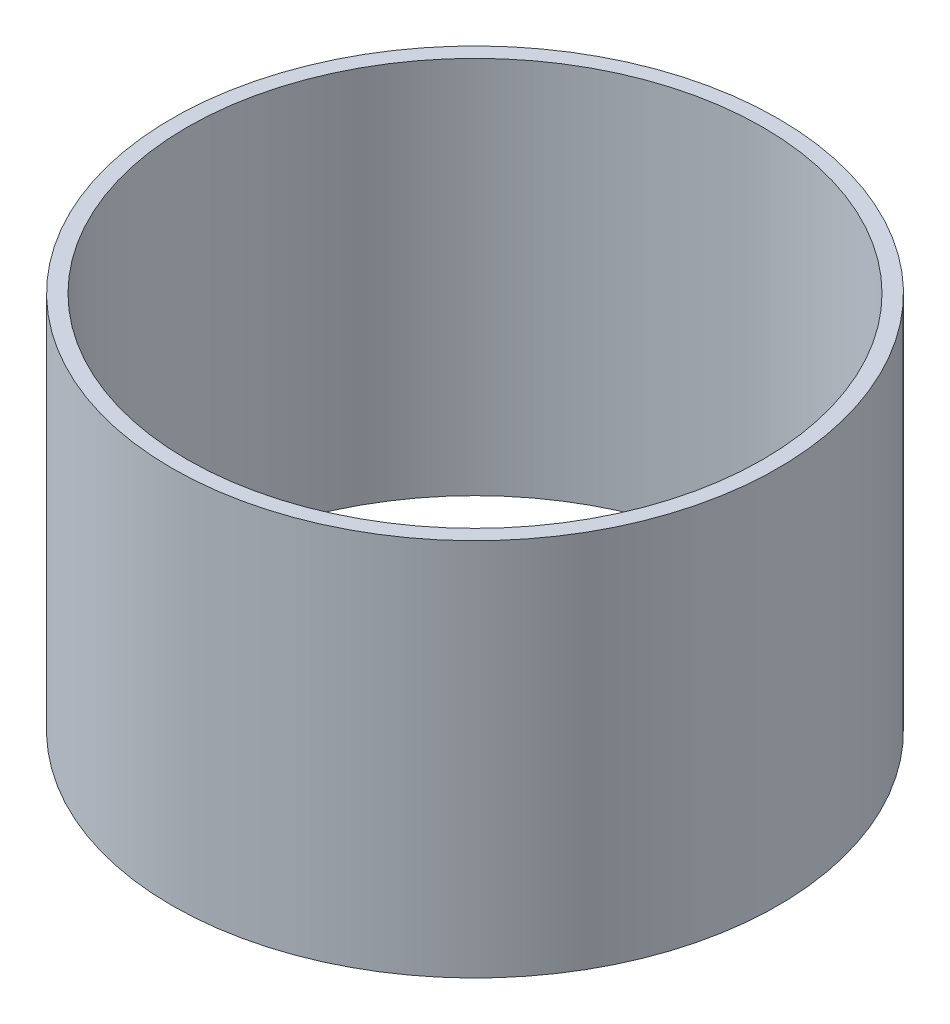
ISO-10303-21;
HEADER;
FILE_DESCRIPTION(('STEP AP214'),'2;1');
FILE_NAME('part.step','',(''),(''),'','','');
FILE_SCHEMA(('AUTOMOTIVE_DESIGN { 1 0 10303 214 1 1 1 1 }'));
ENDSEC;
DATA;
#1=APPLICATION_CONTEXT('core data for automotive mechanical design processes');
#2=APPLICATION_PROTOCOL_DEFINITION('international standard','automotive_design',2000,#1);
#3=PRODUCT_CONTEXT('',#1,'mechanical');
#4=PRODUCT('Part','Part','',(#3));
#5=PRODUCT_RELATED_PRODUCT_CATEGORY('part','',(#4));
#6=PRODUCT_DEFINITION_FORMATION('','',#4);
#7=PRODUCT_DEFINITION_CONTEXT('part definition',#1,'design');
#8=PRODUCT_DEFINITION('design','',#6,#7);
#9=PRODUCT_DEFINITION_SHAPE('','',#8);
#10=(LENGTH_UNIT() NAMED_UNIT(*) SI_UNIT(.MILLI.,.METRE.));
#11=(NAMED_UNIT(*) PLANE_ANGLE_UNIT() SI_UNIT($,.RADIAN.));
#12=(NAMED_UNIT(*) SI_UNIT($,.STERADIAN.) SOLID_ANGLE_UNIT());
#13=UNCERTAINTY_MEASURE_WITH_UNIT(LENGTH_MEASURE(1.E-05),#10,'distance_accuracy_value','');
#14=(GEOMETRIC_REPRESENTATION_CONTEXT(3) GLOBAL_UNCERTAINTY_ASSIGNED_CONTEXT((#13)) GLOBAL_UNIT_ASSIGNED_CONTEXT((#10,
#11,#12)) REPRESENTATION_CONTEXT('',''));
#15=CARTESIAN_POINT('',(0.,0.,0.));
#16=DIRECTION('',(0.,0.,1.));
#17=DIRECTION('',(1.,0.,0.));
#18=AXIS2_PLACEMENT_3D('',#15,#16,#17);
#19=CARTESIAN_POINT('',(0.,50.,0.));
#20=DIRECTION('',(0.,1.,0.));
#21=DIRECTION('',(0.,0.,1.));
#22=AXIS2_PLACEMENT_3D('',#19,#20,#21);
#23=PLANE('',#22);
#24=CARTESIAN_POINT('',(0.,50.,0.));
#25=DIRECTION('',(0.,1.,0.));
#26=DIRECTION('',(0.,0.,1.));
#27=AXIS2_PLACEMENT_3D('',#24,#25,#26);
#28=CIRCLE('',#27,40.);
#29=CARTESIAN_POINT('',(0.,50.,40.));
#30=VERTEX_POINT('',#29);
#31=EDGE_CURVE('E10',#30,#30,#28,.T.);
#32=ORIENTED_EDGE('',*,*,#31,.T.);
#33=EDGE_LOOP('',(#32));
#34=FACE_BOUND('',#33,.T.);
#35=CARTESIAN_POINT('',(0.,50.,0.));
#36=DIRECTION('',(0.,1.,0.));
#37=DIRECTION('',(0.,0.,1.));
#38=AXIS2_PLACEMENT_3D('',#35,#36,#37);
#39=CIRCLE('',#38,38.);
#40=CARTESIAN_POINT('',(0.,50.,38.));
#41=VERTEX_POINT('',#40);
#42=EDGE_CURVE('E42',#41,#41,#39,.T.);
#43=ORIENTED_EDGE('',*,*,#42,.F.);
#44=EDGE_LOOP('',(#43));
#45=FACE_BOUND('',#44,.T.);
#46=ADVANCED_FACE('F31',(#34,#45),#23,.T.);
#47=CARTESIAN_POINT('',(0.,0.,0.));
#48=DIRECTION('',(0.,1.,0.));
#49=DIRECTION('',(0.,0.,1.));
#50=AXIS2_PLACEMENT_3D('',#47,#48,#49);
#51=PLANE('',#50);
#52=CARTESIAN_POINT('',(0.,0.,0.));
#53=DIRECTION('',(0.,1.,0.));
#54=DIRECTION('',(0.,0.,1.));
#55=AXIS2_PLACEMENT_3D('',#52,#53,#54);
#56=CIRCLE('',#55,40.);
#57=CARTESIAN_POINT('',(0.,0.,40.));
#58=VERTEX_POINT('',#57);
#59=EDGE_CURVE('E35',#58,#58,#56,.T.);
#60=ORIENTED_EDGE('',*,*,#59,.F.);
#61=EDGE_LOOP('',(#60));
#62=FACE_BOUND('',#61,.T.);
#63=CARTESIAN_POINT('',(0.,0.,0.));
#64=DIRECTION('',(0.,1.,0.));
#65=DIRECTION('',(0.,0.,1.));
#66=AXIS2_PLACEMENT_3D('',#63,#64,#65);
#67=CIRCLE('',#66,38.);
#68=CARTESIAN_POINT('',(0.,0.,38.));
#69=VERTEX_POINT('',#68);
#70=EDGE_CURVE('E44',#69,#69,#67,.T.);
#71=ORIENTED_EDGE('',*,*,#70,.T.);
#72=EDGE_LOOP('',(#71));
#73=FACE_BOUND('',#72,.T.);
#74=ADVANCED_FACE('F54',(#62,#73),#51,.F.);
#75=CARTESIAN_POINT('',(0.,50.,0.));
#76=DIRECTION('',(0.,-1.,0.));
#77=DIRECTION('',(0.,0.,-1.));
#78=AXIS2_PLACEMENT_3D('',#75,#76,#77);
#79=CYLINDRICAL_SURFACE('',#78,40.);
#80=ORIENTED_EDGE('',*,*,#31,.F.);
#81=EDGE_LOOP('',(#80));
#82=FACE_BOUND('',#81,.T.);
#83=ORIENTED_EDGE('',*,*,#59,.T.);
#84=EDGE_LOOP('',(#83));
#85=FACE_BOUND('',#84,.T.);
#86=ADVANCED_FACE('F33',(#82,#85),#79,.T.);
#87=CARTESIAN_POINT('',(0.,50.,0.));
#88=DIRECTION('',(0.,-1.,0.));
#89=DIRECTION('',(0.,0.,-1.));
#90=AXIS2_PLACEMENT_3D('',#87,#88,#89);
#91=CYLINDRICAL_SURFACE('',#90,38.);
#92=ORIENTED_EDGE('',*,*,#42,.T.);
#93=EDGE_LOOP('',(#92));
#94=FACE_BOUND('',#93,.T.);
#95=ORIENTED_EDGE('',*,*,#70,.F.);
#96=EDGE_LOOP('',(#95));
#97=FACE_BOUND('',#96,.T.);
#98=ADVANCED_FACE('F50',(#94,#97),#91,.F.);
#99=CLOSED_SHELL('',(#46,#74,#86,#98));
#100=MANIFOLD_SOLID_BREP('B2',#99);
#101=ADVANCED_BREP_SHAPE_REPRESENTATION('',(#18,#100),#14);
#102=SHAPE_DEFINITION_REPRESENTATION(#9,#101);
ENDSEC;
END-ISO-10303-21;
